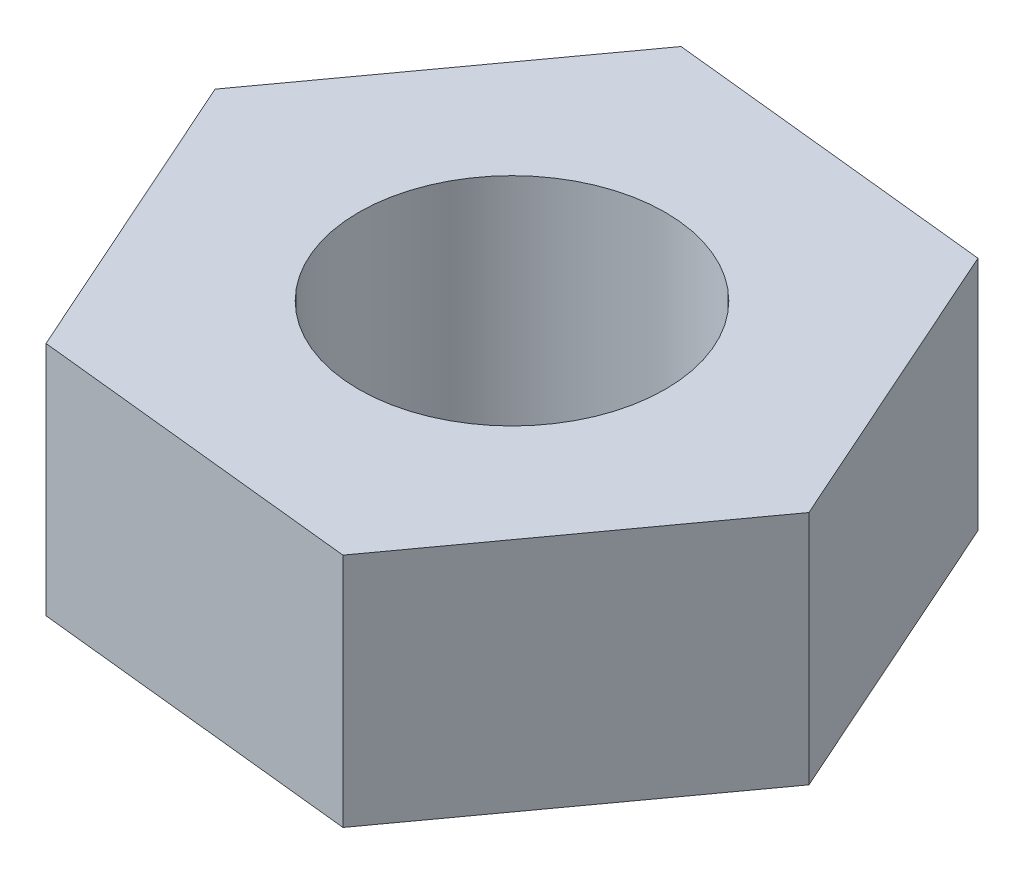
ISO-10303-21;
HEADER;
FILE_DESCRIPTION(('STEP AP214'),'2;1');
FILE_NAME('part.step','',(''),(''),'','','');
FILE_SCHEMA(('AUTOMOTIVE_DESIGN { 1 0 10303 214 1 1 1 1 }'));
ENDSEC;
DATA;
#1=APPLICATION_CONTEXT('core data for automotive mechanical design processes');
#2=APPLICATION_PROTOCOL_DEFINITION('international standard','automotive_design',2000,#1);
#3=PRODUCT_CONTEXT('',#1,'mechanical');
#4=PRODUCT('Part','Part','',(#3));
#5=PRODUCT_RELATED_PRODUCT_CATEGORY('part','',(#4));
#6=PRODUCT_DEFINITION_FORMATION('','',#4);
#7=PRODUCT_DEFINITION_CONTEXT('part definition',#1,'design');
#8=PRODUCT_DEFINITION('design','',#6,#7);
#9=PRODUCT_DEFINITION_SHAPE('','',#8);
#10=(LENGTH_UNIT() NAMED_UNIT(*) SI_UNIT(.MILLI.,.METRE.));
#11=(NAMED_UNIT(*) PLANE_ANGLE_UNIT() SI_UNIT($,.RADIAN.));
#12=(NAMED_UNIT(*) SI_UNIT($,.STERADIAN.) SOLID_ANGLE_UNIT());
#13=UNCERTAINTY_MEASURE_WITH_UNIT(LENGTH_MEASURE(1.E-05),#10,'distance_accuracy_value','');
#14=(GEOMETRIC_REPRESENTATION_CONTEXT(3) GLOBAL_UNCERTAINTY_ASSIGNED_CONTEXT((#13)) GLOBAL_UNIT_ASSIGNED_CONTEXT((#10,
#11,#12)) REPRESENTATION_CONTEXT('',''));
#15=CARTESIAN_POINT('',(0.,0.,0.));
#16=DIRECTION('',(0.,0.,1.));
#17=DIRECTION('',(1.,0.,0.));
#18=AXIS2_PLACEMENT_3D('',#15,#16,#17);
#19=CARTESIAN_POINT('',(-10.91444811212,17.,17.18990731312));
#20=DIRECTION('',(0.,1.,0.));
#21=DIRECTION('',(-0.994521895368374,0.,-0.104528463266696));
#22=AXIS2_PLACEMENT_3D('',#19,#20,#21);
#23=PLANE('',#22);
#24=CARTESIAN_POINT('',(-14.10684605502,17.,19.416407865));
#25=DIRECTION('',(0.,1.,0.));
#26=DIRECTION('',(0.,0.,1.));
#27=AXIS2_PLACEMENT_3D('',#24,#25,#26);
#28=CIRCLE('',#27,1.30000000000145);
#29=CARTESIAN_POINT('',(-14.10684605502,17.,20.7164078650014));
#30=VERTEX_POINT('',#29);
#31=EDGE_CURVE('E21',#30,#30,#28,.F.);
#32=ORIENTED_EDGE('',*,*,#31,.T.);
#33=EDGE_LOOP('',(#32));
#34=FACE_BOUND('',#33,.T.);
#35=DIRECTION('',(-0.406736643075505,0.,-0.913545457642732));
#36=VECTOR('',#35,1.);
#37=CARTESIAN_POINT('',(-16.34503242624,17.,20.41291264053));
#38=LINE('',#37,#36);
#39=CARTESIAN_POINT('',(-16.9203647265875,17.,19.1206951367428));
#40=VERTEX_POINT('',#39);
#41=CARTESIAN_POINT('',(-15.769700125837,17.,21.7051301444581));
#42=VERTEX_POINT('',#41);
#43=EDGE_CURVE('E104',#40,#42,#38,.F.);
#44=ORIENTED_EDGE('',*,*,#43,.T.);
#45=DIRECTION('',(-0.994521895368356,0.,-0.104528463266872));
#46=VECTOR('',#45,1.);
#47=CARTESIAN_POINT('',(-14.362940790025,17.,21.85298650865));
#48=LINE('',#47,#46);
#49=CARTESIAN_POINT('',(-12.9561814542106,17.,22.0008428728409));
#50=VERTEX_POINT('',#49);
#51=EDGE_CURVE('E83',#42,#50,#48,.F.);
#52=ORIENTED_EDGE('',*,*,#51,.T.);
#53=DIRECTION('',(-0.587785252295187,0.,0.809016994372976));
#54=VECTOR('',#53,1.);
#55=CARTESIAN_POINT('',(-12.1247544188,17.,20.856481733115));
#56=LINE('',#55,#54);
#57=CARTESIAN_POINT('',(-11.2933273834725,17.,19.7121205935068));
#58=VERTEX_POINT('',#57);
#59=EDGE_CURVE('E80',#50,#58,#56,.F.);
#60=ORIENTED_EDGE('',*,*,#59,.T.);
#61=DIRECTION('',(0.406736643078338,0.,0.913545457641471));
#62=VECTOR('',#61,1.);
#63=CARTESIAN_POINT('',(-11.868659683795,17.,18.41990308946));
#64=LINE('',#63,#62);
#65=CARTESIAN_POINT('',(-12.4439919842005,17.,17.1276855855408));
#66=VERTEX_POINT('',#65);
#67=EDGE_CURVE('E81',#58,#66,#64,.F.);
#68=ORIENTED_EDGE('',*,*,#67,.T.);
#69=DIRECTION('',(0.994521895368355,0.,0.104528463266872));
#70=VECTOR('',#69,1.);
#71=CARTESIAN_POINT('',(-13.850751320015,17.,16.97982922135));
#72=LINE('',#71,#70);
#73=CARTESIAN_POINT('',(-15.2575106558299,17.,16.831972857154));
#74=VERTEX_POINT('',#73);
#75=EDGE_CURVE('E110',#66,#74,#72,.F.);
#76=ORIENTED_EDGE('',*,*,#75,.T.);
#77=DIRECTION('',(0.587785252291347,0.,-0.809016994375765));
#78=VECTOR('',#77,1.);
#79=CARTESIAN_POINT('',(-16.088937691235,17.,17.97633399688));
#80=LINE('',#79,#78);
#81=EDGE_CURVE('E105',#74,#40,#80,.F.);
#82=ORIENTED_EDGE('',*,*,#81,.T.);
#83=EDGE_LOOP('',(#44,#52,#60,#68,#76,#82));
#84=FACE_BOUND('',#83,.T.);
#85=ADVANCED_FACE('F17',(#34,#84),#23,.T.);
#86=CARTESIAN_POINT('',(-12.38772161077,14.96,17.13359984011));
#87=DIRECTION('',(0.104528463266872,0.,-0.994521895368355));
#88=DIRECTION('',(-0.994521895368355,0.,-0.104528463266872));
#89=AXIS2_PLACEMENT_3D('',#86,#87,#88);
#90=PLANE('',#89);
#91=ORIENTED_EDGE('',*,*,#75,.F.);
#92=DIRECTION('',(0.,1.,0.));
#93=VECTOR('',#92,1.);
#94=CARTESIAN_POINT('',(-12.4439919842019,16.,17.1276855855409));
#95=LINE('',#94,#93);
#96=CARTESIAN_POINT('',(-12.4439919842021,15.,17.1276855855403));
#97=VERTEX_POINT('',#96);
#98=EDGE_CURVE('E90',#66,#97,#95,.F.);
#99=ORIENTED_EDGE('',*,*,#98,.T.);
#100=DIRECTION('',(-0.99452189536837,0.,-0.104528463266729));
#101=VECTOR('',#100,1.);
#102=CARTESIAN_POINT('',(-13.8507513200154,15.,16.9798292213476));
#103=LINE('',#102,#101);
#104=CARTESIAN_POINT('',(-15.2575106558293,15.,16.8319728571533));
#105=VERTEX_POINT('',#104);
#106=EDGE_CURVE('E58',#97,#105,#103,.T.);
#107=ORIENTED_EDGE('',*,*,#106,.T.);
#108=DIRECTION('',(0.,-1.,0.));
#109=VECTOR('',#108,1.);
#110=CARTESIAN_POINT('',(-15.257510655828,16.,16.8319728571515));
#111=LINE('',#110,#109);
#112=EDGE_CURVE('E51',#105,#74,#111,.F.);
#113=ORIENTED_EDGE('',*,*,#112,.T.);
#114=EDGE_LOOP('',(#91,#99,#107,#113));
#115=FACE_BOUND('',#114,.T.);
#116=ADVANCED_FACE('F122',(#115),#90,.T.);
#117=CARTESIAN_POINT('',(-15.22425357441,14.96,16.78619841156));
#118=DIRECTION('',(-0.809016994375765,0.,-0.587785252291347));
#119=DIRECTION('',(-0.587785252291347,0.,0.809016994375765));
#120=AXIS2_PLACEMENT_3D('',#117,#118,#119);
#121=PLANE('',#120);
#122=ORIENTED_EDGE('',*,*,#81,.F.);
#123=ORIENTED_EDGE('',*,*,#112,.F.);
#124=DIRECTION('',(-0.587785252291347,0.,0.809016994375765));
#125=VECTOR('',#124,1.);
#126=CARTESIAN_POINT('',(-15.22425357441,15.,16.78619841156));
#127=LINE('',#126,#125);
#128=CARTESIAN_POINT('',(-16.9203647266432,15.,19.1206951366083));
#129=VERTEX_POINT('',#128);
#130=EDGE_CURVE('E112',#105,#129,#127,.T.);
#131=ORIENTED_EDGE('',*,*,#130,.T.);
#132=DIRECTION('',(0.,-1.,0.));
#133=VECTOR('',#132,1.);
#134=CARTESIAN_POINT('',(-16.9203647266437,16.,19.1206951366072));
#135=LINE('',#134,#133);
#136=EDGE_CURVE('E101',#129,#40,#135,.F.);
#137=ORIENTED_EDGE('',*,*,#136,.T.);
#138=EDGE_LOOP('',(#122,#123,#131,#137));
#139=FACE_BOUND('',#138,.T.);
#140=ADVANCED_FACE('F118',(#139),#121,.T.);
#141=CARTESIAN_POINT('',(-16.94337801866,14.96,19.06900643645));
#142=DIRECTION('',(-0.913545457642732,0.,0.406736643075505));
#143=DIRECTION('',(0.406736643075505,0.,0.913545457642732));
#144=AXIS2_PLACEMENT_3D('',#141,#142,#143);
#145=PLANE('',#144);
#146=ORIENTED_EDGE('',*,*,#43,.F.);
#147=ORIENTED_EDGE('',*,*,#136,.F.);
#148=DIRECTION('',(0.406736643075505,0.,0.913545457642732));
#149=VECTOR('',#148,1.);
#150=CARTESIAN_POINT('',(-16.94337801866,15.,19.06900643645));
#151=LINE('',#150,#149);
#152=CARTESIAN_POINT('',(-15.7697001258363,15.,21.7051301444597));
#153=VERTEX_POINT('',#152);
#154=EDGE_CURVE('E116',#129,#153,#151,.T.);
#155=ORIENTED_EDGE('',*,*,#154,.T.);
#156=DIRECTION('',(0.,-1.,0.));
#157=VECTOR('',#156,1.);
#158=CARTESIAN_POINT('',(-15.7697001258397,16.,21.7051301444575));
#159=LINE('',#158,#157);
#160=EDGE_CURVE('E106',#153,#42,#159,.F.);
#161=ORIENTED_EDGE('',*,*,#160,.T.);
#162=EDGE_LOOP('',(#146,#147,#155,#161));
#163=FACE_BOUND('',#162,.T.);
#164=ADVANCED_FACE('F128',(#163),#145,.T.);
#165=CARTESIAN_POINT('',(-15.82597049927,14.96,21.69921588989));
#166=DIRECTION('',(-0.104528463266872,0.,0.994521895368355));
#167=DIRECTION('',(0.994521895368355,0.,0.104528463266872));
#168=AXIS2_PLACEMENT_3D('',#165,#166,#167);
#169=PLANE('',#168);
#170=ORIENTED_EDGE('',*,*,#51,.F.);
#171=ORIENTED_EDGE('',*,*,#160,.F.);
#172=DIRECTION('',(0.994521895368201,0.,0.104528463268344));
#173=VECTOR('',#172,1.);
#174=CARTESIAN_POINT('',(-14.3629407900254,15.,21.8529865086546));
#175=LINE('',#174,#173);
#176=CARTESIAN_POINT('',(-12.9561814542153,15.,22.0008428728435));
#177=VERTEX_POINT('',#176);
#178=EDGE_CURVE('E99',#153,#177,#175,.T.);
#179=ORIENTED_EDGE('',*,*,#178,.T.);
#180=DIRECTION('',(0.,-1.,0.));
#181=VECTOR('',#180,1.);
#182=CARTESIAN_POINT('',(-12.9561814542118,16.,22.0008428728387));
#183=LINE('',#182,#181);
#184=EDGE_CURVE('E86',#177,#50,#183,.F.);
#185=ORIENTED_EDGE('',*,*,#184,.T.);
#186=EDGE_LOOP('',(#170,#171,#179,#185));
#187=FACE_BOUND('',#186,.T.);
#188=ADVANCED_FACE('F125',(#187),#169,.T.);
#189=CARTESIAN_POINT('',(-12.98943853563,14.96,22.04661731843));
#190=DIRECTION('',(0.809016994372976,0.,0.587785252295187));
#191=DIRECTION('',(0.587785252295187,0.,-0.809016994372976));
#192=AXIS2_PLACEMENT_3D('',#189,#190,#191);
#193=PLANE('',#192);
#194=ORIENTED_EDGE('',*,*,#59,.F.);
#195=ORIENTED_EDGE('',*,*,#184,.F.);
#196=DIRECTION('',(0.587785252295187,0.,-0.809016994372976));
#197=VECTOR('',#196,1.);
#198=CARTESIAN_POINT('',(-12.98943853563,15.,22.04661731843));
#199=LINE('',#198,#197);
#200=CARTESIAN_POINT('',(-11.2933273833846,15.,19.7121205933871));
#201=VERTEX_POINT('',#200);
#202=EDGE_CURVE('E95',#177,#201,#199,.T.);
#203=ORIENTED_EDGE('',*,*,#202,.T.);
#204=DIRECTION('',(0.,-1.,0.));
#205=VECTOR('',#204,1.);
#206=CARTESIAN_POINT('',(-11.2933273833844,16.,19.7121205933875));
#207=LINE('',#206,#205);
#208=EDGE_CURVE('E36',#201,#58,#207,.F.);
#209=ORIENTED_EDGE('',*,*,#208,.T.);
#210=EDGE_LOOP('',(#194,#195,#203,#209));
#211=FACE_BOUND('',#210,.T.);
#212=ADVANCED_FACE('F93',(#211),#193,.T.);
#213=CARTESIAN_POINT('',(-11.27031409137,14.96,19.76380929354));
#214=DIRECTION('',(0.913545457641471,0.,-0.406736643078339));
#215=DIRECTION('',(-0.406736643078339,0.,-0.913545457641471));
#216=AXIS2_PLACEMENT_3D('',#213,#214,#215);
#217=PLANE('',#216);
#218=ORIENTED_EDGE('',*,*,#67,.F.);
#219=ORIENTED_EDGE('',*,*,#208,.F.);
#220=DIRECTION('',(-0.406736643078339,0.,-0.913545457641471));
#221=VECTOR('',#220,1.);
#222=CARTESIAN_POINT('',(-11.27031409137,15.,19.76380929354));
#223=LINE('',#222,#221);
#224=EDGE_CURVE('E27',#201,#97,#223,.T.);
#225=ORIENTED_EDGE('',*,*,#224,.T.);
#226=ORIENTED_EDGE('',*,*,#98,.F.);
#227=EDGE_LOOP('',(#218,#219,#225,#226));
#228=FACE_BOUND('',#227,.T.);
#229=ADVANCED_FACE('F89',(#228),#217,.T.);
#230=CARTESIAN_POINT('',(-14.10684605502,15.,19.416407865));
#231=DIRECTION('',(0.,1.,0.));
#232=DIRECTION('',(0.,0.,1.));
#233=AXIS2_PLACEMENT_3D('',#230,#231,#232);
#234=CYLINDRICAL_SURFACE('',#233,1.30000000000145);
#235=ORIENTED_EDGE('',*,*,#31,.F.);
#236=EDGE_LOOP('',(#235));
#237=FACE_BOUND('',#236,.T.);
#238=CARTESIAN_POINT('',(-14.10684605502,15.,19.416407865));
#239=DIRECTION('',(0.,1.,0.));
#240=DIRECTION('',(0.,0.,1.));
#241=AXIS2_PLACEMENT_3D('',#238,#239,#240);
#242=CIRCLE('',#241,1.30000000000145);
#243=CARTESIAN_POINT('',(-14.10684605502,15.,20.7164078650014));
#244=VERTEX_POINT('',#243);
#245=EDGE_CURVE('E11',#244,#244,#242,.F.);
#246=ORIENTED_EDGE('',*,*,#245,.T.);
#247=EDGE_LOOP('',(#246));
#248=FACE_BOUND('',#247,.T.);
#249=ADVANCED_FACE('F143',(#237,#248),#234,.F.);
#250=CARTESIAN_POINT('',(-10.91444811212,15.,17.18990731312));
#251=DIRECTION('',(0.,1.,0.));
#252=DIRECTION('',(-0.994521895368374,0.,-0.104528463266696));
#253=AXIS2_PLACEMENT_3D('',#250,#251,#252);
#254=PLANE('',#253);
#255=ORIENTED_EDGE('',*,*,#245,.F.);
#256=EDGE_LOOP('',(#255));
#257=FACE_BOUND('',#256,.T.);
#258=ORIENTED_EDGE('',*,*,#202,.F.);
#259=ORIENTED_EDGE('',*,*,#178,.F.);
#260=ORIENTED_EDGE('',*,*,#154,.F.);
#261=ORIENTED_EDGE('',*,*,#130,.F.);
#262=ORIENTED_EDGE('',*,*,#106,.F.);
#263=ORIENTED_EDGE('',*,*,#224,.F.);
#264=EDGE_LOOP('',(#258,#259,#260,#261,#262,#263));
#265=FACE_BOUND('',#264,.T.);
#266=ADVANCED_FACE('F19',(#257,#265),#254,.F.);
#267=CLOSED_SHELL('',(#85,#116,#140,#164,#188,#212,#229,#249,#266));
#268=MANIFOLD_SOLID_BREP('B1',#267);
#269=ADVANCED_BREP_SHAPE_REPRESENTATION('',(#18,#268),#14);
#270=SHAPE_DEFINITION_REPRESENTATION(#9,#269);
ENDSEC;
END-ISO-10303-21;
